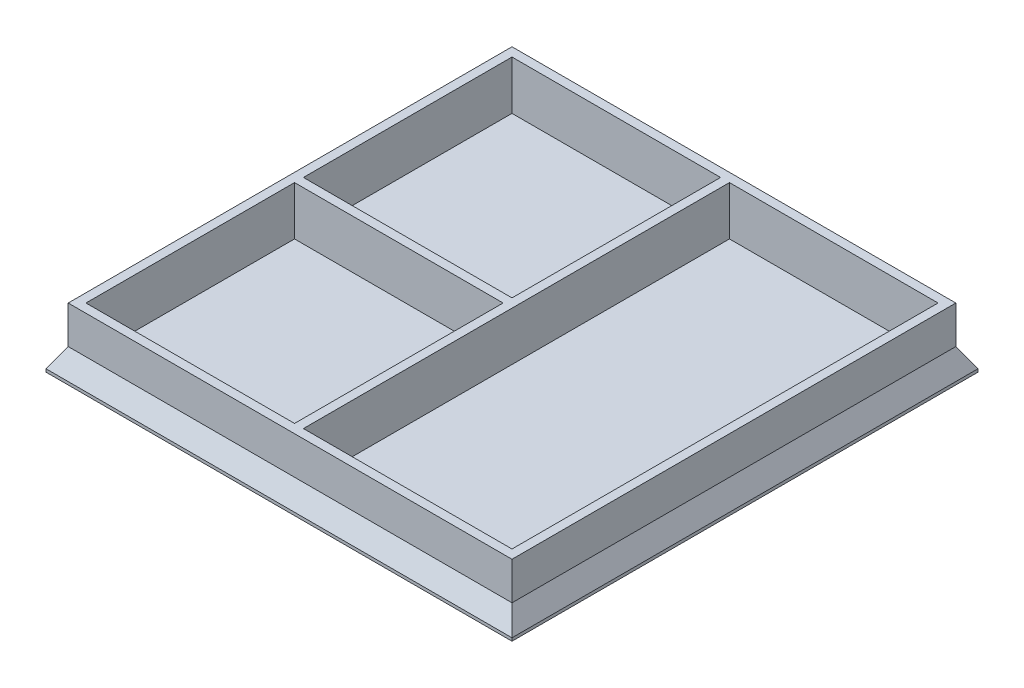
ISO-10303-21;
HEADER;
FILE_DESCRIPTION(('STEP AP214'),'2;1');
FILE_NAME('part.step','',(''),(''),'','','');
FILE_SCHEMA(('AUTOMOTIVE_DESIGN { 1 0 10303 214 1 1 1 1 }'));
ENDSEC;
DATA;
#1=APPLICATION_CONTEXT('core data for automotive mechanical design processes');
#2=APPLICATION_PROTOCOL_DEFINITION('international standard','automotive_design',2000,#1);
#3=PRODUCT_CONTEXT('',#1,'mechanical');
#4=PRODUCT('Part','Part','',(#3));
#5=PRODUCT_RELATED_PRODUCT_CATEGORY('part','',(#4));
#6=PRODUCT_DEFINITION_FORMATION('','',#4);
#7=PRODUCT_DEFINITION_CONTEXT('part definition',#1,'design');
#8=PRODUCT_DEFINITION('design','',#6,#7);
#9=PRODUCT_DEFINITION_SHAPE('','',#8);
#10=(LENGTH_UNIT() NAMED_UNIT(*) SI_UNIT(.MILLI.,.METRE.));
#11=(NAMED_UNIT(*) PLANE_ANGLE_UNIT() SI_UNIT($,.RADIAN.));
#12=(NAMED_UNIT(*) SI_UNIT($,.STERADIAN.) SOLID_ANGLE_UNIT());
#13=UNCERTAINTY_MEASURE_WITH_UNIT(LENGTH_MEASURE(1.E-05),#10,'distance_accuracy_value','');
#14=(GEOMETRIC_REPRESENTATION_CONTEXT(3) GLOBAL_UNCERTAINTY_ASSIGNED_CONTEXT((#13)) GLOBAL_UNIT_ASSIGNED_CONTEXT((#10,
#11,#12)) REPRESENTATION_CONTEXT('',''));
#15=CARTESIAN_POINT('',(0.,0.,0.));
#16=DIRECTION('',(0.,0.,1.));
#17=DIRECTION('',(1.,0.,0.));
#18=AXIS2_PLACEMENT_3D('',#15,#16,#17);
#19=CARTESIAN_POINT('',(0.,10.8,-41.2));
#20=DIRECTION('',(0.,0.,-1.));
#21=DIRECTION('',(-1.,0.,0.));
#22=AXIS2_PLACEMENT_3D('',#19,#20,#21);
#23=PLANE('',#22);
#24=DIRECTION('',(-1.,0.,0.));
#25=VECTOR('',#24,1.);
#26=CARTESIAN_POINT('',(0.,2.,-41.2));
#27=LINE('',#26,#25);
#28=CARTESIAN_POINT('',(-42.8,2.,-41.2));
#29=VERTEX_POINT('',#28);
#30=CARTESIAN_POINT('',(-80.4,2.,-41.2));
#31=VERTEX_POINT('',#30);
#32=EDGE_CURVE('E376',#29,#31,#27,.T.);
#33=ORIENTED_EDGE('',*,*,#32,.F.);
#34=DIRECTION('',(0.,-1.,0.));
#35=VECTOR('',#34,1.);
#36=CARTESIAN_POINT('',(-42.8,10.8,-41.2));
#37=LINE('',#36,#35);
#38=CARTESIAN_POINT('',(-42.8,10.8,-41.2));
#39=VERTEX_POINT('',#38);
#40=EDGE_CURVE('E295',#39,#29,#37,.T.);
#41=ORIENTED_EDGE('',*,*,#40,.F.);
#42=DIRECTION('',(1.,0.,0.));
#43=VECTOR('',#42,1.);
#44=CARTESIAN_POINT('',(0.,10.8,-41.2));
#45=LINE('',#44,#43);
#46=CARTESIAN_POINT('',(-80.4,10.8,-41.2));
#47=VERTEX_POINT('',#46);
#48=EDGE_CURVE('E267',#47,#39,#45,.T.);
#49=ORIENTED_EDGE('',*,*,#48,.F.);
#50=DIRECTION('',(0.,-1.,0.));
#51=VECTOR('',#50,1.);
#52=CARTESIAN_POINT('',(-80.4,10.8,-41.2));
#53=LINE('',#52,#51);
#54=EDGE_CURVE('E282',#47,#31,#53,.T.);
#55=ORIENTED_EDGE('',*,*,#54,.T.);
#56=EDGE_LOOP('',(#33,#41,#49,#55));
#57=FACE_BOUND('',#56,.T.);
#58=ADVANCED_FACE('F41',(#57),#23,.F.);
#59=CARTESIAN_POINT('',(-42.8,10.8,0.));
#60=DIRECTION('',(1.,0.,0.));
#61=DIRECTION('',(0.,0.,-1.));
#62=AXIS2_PLACEMENT_3D('',#59,#60,#61);
#63=PLANE('',#62);
#64=DIRECTION('',(0.,0.,-1.));
#65=VECTOR('',#64,1.);
#66=CARTESIAN_POINT('',(-42.8,2.,0.));
#67=LINE('',#66,#65);
#68=CARTESIAN_POINT('',(-42.8,2.,-3.6));
#69=VERTEX_POINT('',#68);
#70=EDGE_CURVE('E373',#69,#29,#67,.T.);
#71=ORIENTED_EDGE('',*,*,#70,.F.);
#72=DIRECTION('',(0.,-1.,0.));
#73=VECTOR('',#72,1.);
#74=CARTESIAN_POINT('',(-42.8,10.8,-3.6));
#75=LINE('',#74,#73);
#76=CARTESIAN_POINT('',(-42.8,10.8,-3.6));
#77=VERTEX_POINT('',#76);
#78=EDGE_CURVE('E291',#77,#69,#75,.T.);
#79=ORIENTED_EDGE('',*,*,#78,.F.);
#80=DIRECTION('',(0.,0.,1.));
#81=VECTOR('',#80,1.);
#82=CARTESIAN_POINT('',(-42.8,10.8,0.));
#83=LINE('',#82,#81);
#84=EDGE_CURVE('E271',#39,#77,#83,.T.);
#85=ORIENTED_EDGE('',*,*,#84,.F.);
#86=ORIENTED_EDGE('',*,*,#40,.T.);
#87=EDGE_LOOP('',(#71,#79,#85,#86));
#88=FACE_BOUND('',#87,.T.);
#89=ADVANCED_FACE('F458',(#88),#63,.F.);
#90=CARTESIAN_POINT('',(0.,10.8,-3.6));
#91=DIRECTION('',(0.,0.,-1.));
#92=DIRECTION('',(-1.,0.,0.));
#93=AXIS2_PLACEMENT_3D('',#90,#91,#92);
#94=PLANE('',#93);
#95=ORIENTED_EDGE('',*,*,#78,.T.);
#96=DIRECTION('',(-1.,0.,0.));
#97=VECTOR('',#96,1.);
#98=CARTESIAN_POINT('',(0.,2.,-3.6));
#99=LINE('',#98,#97);
#100=CARTESIAN_POINT('',(-80.4,2.,-3.6));
#101=VERTEX_POINT('',#100);
#102=EDGE_CURVE('E369',#69,#101,#99,.T.);
#103=ORIENTED_EDGE('',*,*,#102,.T.);
#104=DIRECTION('',(0.,-1.,0.));
#105=VECTOR('',#104,1.);
#106=CARTESIAN_POINT('',(-80.4,10.8,-3.6));
#107=LINE('',#106,#105);
#108=CARTESIAN_POINT('',(-80.4,10.8,-3.6));
#109=VERTEX_POINT('',#108);
#110=EDGE_CURVE('E286',#109,#101,#107,.T.);
#111=ORIENTED_EDGE('',*,*,#110,.F.);
#112=DIRECTION('',(1.,0.,0.));
#113=VECTOR('',#112,1.);
#114=CARTESIAN_POINT('',(0.,10.8,-3.6));
#115=LINE('',#114,#113);
#116=EDGE_CURVE('E274',#109,#77,#115,.T.);
#117=ORIENTED_EDGE('',*,*,#116,.T.);
#118=EDGE_LOOP('',(#95,#103,#111,#117));
#119=FACE_BOUND('',#118,.T.);
#120=ADVANCED_FACE('F460',(#119),#94,.T.);
#121=CARTESIAN_POINT('',(0.,10.8,-80.4));
#122=DIRECTION('',(0.,0.,-1.));
#123=DIRECTION('',(-1.,0.,0.));
#124=AXIS2_PLACEMENT_3D('',#121,#122,#123);
#125=PLANE('',#124);
#126=DIRECTION('',(-1.,0.,0.));
#127=VECTOR('',#126,1.);
#128=CARTESIAN_POINT('',(0.,2.,-80.4));
#129=LINE('',#128,#127);
#130=CARTESIAN_POINT('',(-42.8,2.,-80.4));
#131=VERTEX_POINT('',#130);
#132=CARTESIAN_POINT('',(-80.4,2.,-80.4));
#133=VERTEX_POINT('',#132);
#134=EDGE_CURVE('E366',#131,#133,#129,.T.);
#135=ORIENTED_EDGE('',*,*,#134,.F.);
#136=DIRECTION('',(0.,-1.,0.));
#137=VECTOR('',#136,1.);
#138=CARTESIAN_POINT('',(-42.8,10.8,-80.4));
#139=LINE('',#138,#137);
#140=CARTESIAN_POINT('',(-42.8,10.8,-80.4));
#141=VERTEX_POINT('',#140);
#142=EDGE_CURVE('E287',#141,#131,#139,.T.);
#143=ORIENTED_EDGE('',*,*,#142,.F.);
#144=DIRECTION('',(1.,0.,0.));
#145=VECTOR('',#144,1.);
#146=CARTESIAN_POINT('',(0.,10.8,-80.4));
#147=LINE('',#146,#145);
#148=CARTESIAN_POINT('',(-80.4,10.8,-80.4));
#149=VERTEX_POINT('',#148);
#150=EDGE_CURVE('E252',#149,#141,#147,.T.);
#151=ORIENTED_EDGE('',*,*,#150,.F.);
#152=DIRECTION('',(0.,-1.,0.));
#153=VECTOR('',#152,1.);
#154=CARTESIAN_POINT('',(-80.4,10.8,-80.4));
#155=LINE('',#154,#153);
#156=EDGE_CURVE('E300',#149,#133,#155,.T.);
#157=ORIENTED_EDGE('',*,*,#156,.T.);
#158=EDGE_LOOP('',(#135,#143,#151,#157));
#159=FACE_BOUND('',#158,.T.);
#160=ADVANCED_FACE('F497',(#159),#125,.F.);
#161=CARTESIAN_POINT('',(-42.8,10.8,0.));
#162=DIRECTION('',(1.,0.,0.));
#163=DIRECTION('',(0.,0.,-1.));
#164=AXIS2_PLACEMENT_3D('',#161,#162,#163);
#165=PLANE('',#164);
#166=DIRECTION('',(0.,0.,-1.));
#167=VECTOR('',#166,1.);
#168=CARTESIAN_POINT('',(-42.8,2.,0.));
#169=LINE('',#168,#167);
#170=CARTESIAN_POINT('',(-42.8,2.,-42.8));
#171=VERTEX_POINT('',#170);
#172=EDGE_CURVE('E363',#171,#131,#169,.T.);
#173=ORIENTED_EDGE('',*,*,#172,.F.);
#174=DIRECTION('',(0.,-1.,0.));
#175=VECTOR('',#174,1.);
#176=CARTESIAN_POINT('',(-42.8,10.8,-42.8));
#177=LINE('',#176,#175);
#178=CARTESIAN_POINT('',(-42.8,10.8,-42.8));
#179=VERTEX_POINT('',#178);
#180=EDGE_CURVE('E309',#179,#171,#177,.T.);
#181=ORIENTED_EDGE('',*,*,#180,.F.);
#182=DIRECTION('',(0.,0.,1.));
#183=VECTOR('',#182,1.);
#184=CARTESIAN_POINT('',(-42.8,10.8,0.));
#185=LINE('',#184,#183);
#186=EDGE_CURVE('E256',#141,#179,#185,.T.);
#187=ORIENTED_EDGE('',*,*,#186,.F.);
#188=ORIENTED_EDGE('',*,*,#142,.T.);
#189=EDGE_LOOP('',(#173,#181,#187,#188));
#190=FACE_BOUND('',#189,.T.);
#191=ADVANCED_FACE('F493',(#190),#165,.F.);
#192=CARTESIAN_POINT('',(0.,10.8,-42.8));
#193=DIRECTION('',(0.,0.,-1.));
#194=DIRECTION('',(-1.,0.,0.));
#195=AXIS2_PLACEMENT_3D('',#192,#193,#194);
#196=PLANE('',#195);
#197=ORIENTED_EDGE('',*,*,#180,.T.);
#198=DIRECTION('',(-1.,0.,0.));
#199=VECTOR('',#198,1.);
#200=CARTESIAN_POINT('',(0.,2.,-42.8));
#201=LINE('',#200,#199);
#202=CARTESIAN_POINT('',(-80.4,2.,-42.8));
#203=VERTEX_POINT('',#202);
#204=EDGE_CURVE('E359',#171,#203,#201,.T.);
#205=ORIENTED_EDGE('',*,*,#204,.T.);
#206=DIRECTION('',(0.,-1.,0.));
#207=VECTOR('',#206,1.);
#208=CARTESIAN_POINT('',(-80.4,10.8,-42.8));
#209=LINE('',#208,#207);
#210=CARTESIAN_POINT('',(-80.4,10.8,-42.8));
#211=VERTEX_POINT('',#210);
#212=EDGE_CURVE('E304',#211,#203,#209,.T.);
#213=ORIENTED_EDGE('',*,*,#212,.F.);
#214=DIRECTION('',(1.,0.,0.));
#215=VECTOR('',#214,1.);
#216=CARTESIAN_POINT('',(0.,10.8,-42.8));
#217=LINE('',#216,#215);
#218=EDGE_CURVE('E259',#211,#179,#217,.T.);
#219=ORIENTED_EDGE('',*,*,#218,.T.);
#220=EDGE_LOOP('',(#197,#205,#213,#219));
#221=FACE_BOUND('',#220,.T.);
#222=ADVANCED_FACE('F489',(#221),#196,.T.);
#223=CARTESIAN_POINT('',(0.,10.8,-80.4));
#224=DIRECTION('',(0.,0.,-1.));
#225=DIRECTION('',(-1.,0.,0.));
#226=AXIS2_PLACEMENT_3D('',#223,#224,#225);
#227=PLANE('',#226);
#228=DIRECTION('',(-1.,0.,0.));
#229=VECTOR('',#228,1.);
#230=CARTESIAN_POINT('',(0.,2.,-80.4));
#231=LINE('',#230,#229);
#232=CARTESIAN_POINT('',(-3.60000000000001,2.,-80.4));
#233=VERTEX_POINT('',#232);
#234=CARTESIAN_POINT('',(-41.2,2.,-80.4));
#235=VERTEX_POINT('',#234);
#236=EDGE_CURVE('E356',#233,#235,#231,.T.);
#237=ORIENTED_EDGE('',*,*,#236,.F.);
#238=DIRECTION('',(0.,-1.,0.));
#239=VECTOR('',#238,1.);
#240=CARTESIAN_POINT('',(-3.60000000000001,10.8,-80.4));
#241=LINE('',#240,#239);
#242=CARTESIAN_POINT('',(-3.60000000000001,10.8,-80.4));
#243=VERTEX_POINT('',#242);
#244=EDGE_CURVE('E305',#243,#233,#241,.T.);
#245=ORIENTED_EDGE('',*,*,#244,.F.);
#246=DIRECTION('',(1.,0.,0.));
#247=VECTOR('',#246,1.);
#248=CARTESIAN_POINT('',(0.,10.8,-80.4));
#249=LINE('',#248,#247);
#250=CARTESIAN_POINT('',(-41.2,10.8,-80.4));
#251=VERTEX_POINT('',#250);
#252=EDGE_CURVE('E237',#251,#243,#249,.T.);
#253=ORIENTED_EDGE('',*,*,#252,.F.);
#254=DIRECTION('',(0.,-1.,0.));
#255=VECTOR('',#254,1.);
#256=CARTESIAN_POINT('',(-41.2,10.8,-80.4));
#257=LINE('',#256,#255);
#258=EDGE_CURVE('E205',#251,#235,#257,.T.);
#259=ORIENTED_EDGE('',*,*,#258,.T.);
#260=EDGE_LOOP('',(#237,#245,#253,#259));
#261=FACE_BOUND('',#260,.T.);
#262=ADVANCED_FACE('F492',(#261),#227,.F.);
#263=CARTESIAN_POINT('',(-3.6,10.8,0.));
#264=DIRECTION('',(1.,0.,0.));
#265=DIRECTION('',(0.,0.,-1.));
#266=AXIS2_PLACEMENT_3D('',#263,#264,#265);
#267=PLANE('',#266);
#268=DIRECTION('',(0.,0.,-1.));
#269=VECTOR('',#268,1.);
#270=CARTESIAN_POINT('',(-3.6,2.,0.));
#271=LINE('',#270,#269);
#272=CARTESIAN_POINT('',(-3.6,2.,-3.6));
#273=VERTEX_POINT('',#272);
#274=EDGE_CURVE('E353',#273,#233,#271,.T.);
#275=ORIENTED_EDGE('',*,*,#274,.F.);
#276=DIRECTION('',(0.,-1.,0.));
#277=VECTOR('',#276,1.);
#278=CARTESIAN_POINT('',(-3.6,10.8,-3.6));
#279=LINE('',#278,#277);
#280=CARTESIAN_POINT('',(-3.6,10.8,-3.6));
#281=VERTEX_POINT('',#280);
#282=EDGE_CURVE('E323',#281,#273,#279,.T.);
#283=ORIENTED_EDGE('',*,*,#282,.F.);
#284=DIRECTION('',(0.,0.,1.));
#285=VECTOR('',#284,1.);
#286=CARTESIAN_POINT('',(-3.6,10.8,0.));
#287=LINE('',#286,#285);
#288=EDGE_CURVE('E241',#243,#281,#287,.T.);
#289=ORIENTED_EDGE('',*,*,#288,.F.);
#290=ORIENTED_EDGE('',*,*,#244,.T.);
#291=EDGE_LOOP('',(#275,#283,#289,#290));
#292=FACE_BOUND('',#291,.T.);
#293=ADVANCED_FACE('F508',(#292),#267,.F.);
#294=CARTESIAN_POINT('',(0.,10.8,-3.6));
#295=DIRECTION('',(0.,0.,-1.));
#296=DIRECTION('',(-1.,0.,0.));
#297=AXIS2_PLACEMENT_3D('',#294,#295,#296);
#298=PLANE('',#297);
#299=ORIENTED_EDGE('',*,*,#282,.T.);
#300=DIRECTION('',(-1.,0.,0.));
#301=VECTOR('',#300,1.);
#302=CARTESIAN_POINT('',(0.,2.,-3.6));
#303=LINE('',#302,#301);
#304=CARTESIAN_POINT('',(-41.2,2.,-3.6));
#305=VERTEX_POINT('',#304);
#306=EDGE_CURVE('E349',#273,#305,#303,.T.);
#307=ORIENTED_EDGE('',*,*,#306,.T.);
#308=DIRECTION('',(0.,-1.,0.));
#309=VECTOR('',#308,1.);
#310=CARTESIAN_POINT('',(-41.2,10.8,-3.6));
#311=LINE('',#310,#309);
#312=CARTESIAN_POINT('',(-41.2,10.8,-3.6));
#313=VERTEX_POINT('',#312);
#314=EDGE_CURVE('E319',#313,#305,#311,.T.);
#315=ORIENTED_EDGE('',*,*,#314,.F.);
#316=DIRECTION('',(1.,0.,0.));
#317=VECTOR('',#316,1.);
#318=CARTESIAN_POINT('',(0.,10.8,-3.6));
#319=LINE('',#318,#317);
#320=EDGE_CURVE('E244',#313,#281,#319,.T.);
#321=ORIENTED_EDGE('',*,*,#320,.T.);
#322=EDGE_LOOP('',(#299,#307,#315,#321));
#323=FACE_BOUND('',#322,.T.);
#324=ADVANCED_FACE('F505',(#323),#298,.T.);
#325=CARTESIAN_POINT('',(-1.99999999999999,10.8,0.));
#326=DIRECTION('',(1.,0.,0.));
#327=DIRECTION('',(0.,0.,-1.));
#328=AXIS2_PLACEMENT_3D('',#325,#326,#327);
#329=PLANE('',#328);
#330=DIRECTION('',(0.,0.,1.));
#331=VECTOR('',#330,1.);
#332=CARTESIAN_POINT('',(-1.99999999999999,4.,0.));
#333=LINE('',#332,#331);
#334=CARTESIAN_POINT('',(-1.99999999999999,4.,-82.));
#335=VERTEX_POINT('',#334);
#336=CARTESIAN_POINT('',(-1.99999999999999,4.,-2.));
#337=VERTEX_POINT('',#336);
#338=EDGE_CURVE('E181',#335,#337,#333,.T.);
#339=ORIENTED_EDGE('',*,*,#338,.F.);
#340=DIRECTION('',(0.,-1.,0.));
#341=VECTOR('',#340,1.);
#342=CARTESIAN_POINT('',(-1.99999999999999,10.8,-82.));
#343=LINE('',#342,#341);
#344=CARTESIAN_POINT('',(-1.99999999999999,10.8,-82.));
#345=VERTEX_POINT('',#344);
#346=EDGE_CURVE('E185',#345,#335,#343,.T.);
#347=ORIENTED_EDGE('',*,*,#346,.F.);
#348=DIRECTION('',(0.,0.,1.));
#349=VECTOR('',#348,1.);
#350=CARTESIAN_POINT('',(-1.99999999999999,10.8,0.));
#351=LINE('',#350,#349);
#352=CARTESIAN_POINT('',(-1.99999999999999,10.8,-2.));
#353=VERTEX_POINT('',#352);
#354=EDGE_CURVE('E226',#345,#353,#351,.T.);
#355=ORIENTED_EDGE('',*,*,#354,.T.);
#356=DIRECTION('',(0.,-1.,0.));
#357=VECTOR('',#356,1.);
#358=CARTESIAN_POINT('',(-1.99999999999999,10.8,-2.));
#359=LINE('',#358,#357);
#360=EDGE_CURVE('E188',#353,#337,#359,.T.);
#361=ORIENTED_EDGE('',*,*,#360,.T.);
#362=EDGE_LOOP('',(#339,#347,#355,#361));
#363=FACE_BOUND('',#362,.T.);
#364=ADVANCED_FACE('F183',(#363),#329,.T.);
#365=CARTESIAN_POINT('',(0.,10.8,-82.));
#366=DIRECTION('',(0.,0.,-1.));
#367=DIRECTION('',(-1.,0.,0.));
#368=AXIS2_PLACEMENT_3D('',#365,#366,#367);
#369=PLANE('',#368);
#370=DIRECTION('',(1.,0.,0.));
#371=VECTOR('',#370,1.);
#372=CARTESIAN_POINT('',(0.,4.,-82.));
#373=LINE('',#372,#371);
#374=CARTESIAN_POINT('',(-82.,4.,-82.));
#375=VERTEX_POINT('',#374);
#376=EDGE_CURVE('E195',#375,#335,#373,.T.);
#377=ORIENTED_EDGE('',*,*,#376,.F.);
#378=DIRECTION('',(0.,-1.,0.));
#379=VECTOR('',#378,1.);
#380=CARTESIAN_POINT('',(-82.,10.8,-82.));
#381=LINE('',#380,#379);
#382=CARTESIAN_POINT('',(-82.,10.8,-82.));
#383=VERTEX_POINT('',#382);
#384=EDGE_CURVE('E206',#383,#375,#381,.T.);
#385=ORIENTED_EDGE('',*,*,#384,.F.);
#386=DIRECTION('',(1.,0.,0.));
#387=VECTOR('',#386,1.);
#388=CARTESIAN_POINT('',(0.,10.8,-82.));
#389=LINE('',#388,#387);
#390=EDGE_CURVE('E203',#383,#345,#389,.T.);
#391=ORIENTED_EDGE('',*,*,#390,.T.);
#392=ORIENTED_EDGE('',*,*,#346,.T.);
#393=EDGE_LOOP('',(#377,#385,#391,#392));
#394=FACE_BOUND('',#393,.T.);
#395=ADVANCED_FACE('F199',(#394),#369,.T.);
#396=CARTESIAN_POINT('',(-82.,10.8,0.));
#397=DIRECTION('',(1.,0.,0.));
#398=DIRECTION('',(0.,0.,-1.));
#399=AXIS2_PLACEMENT_3D('',#396,#397,#398);
#400=PLANE('',#399);
#401=ORIENTED_EDGE('',*,*,#384,.T.);
#402=DIRECTION('',(0.,0.,1.));
#403=VECTOR('',#402,1.);
#404=CARTESIAN_POINT('',(-82.,4.,0.));
#405=LINE('',#404,#403);
#406=CARTESIAN_POINT('',(-82.,4.,-2.));
#407=VERTEX_POINT('',#406);
#408=EDGE_CURVE('E222',#375,#407,#405,.T.);
#409=ORIENTED_EDGE('',*,*,#408,.T.);
#410=DIRECTION('',(0.,-1.,0.));
#411=VECTOR('',#410,1.);
#412=CARTESIAN_POINT('',(-82.,10.8,-2.));
#413=LINE('',#412,#411);
#414=CARTESIAN_POINT('',(-82.,10.8,-2.));
#415=VERTEX_POINT('',#414);
#416=EDGE_CURVE('E332',#415,#407,#413,.T.);
#417=ORIENTED_EDGE('',*,*,#416,.F.);
#418=DIRECTION('',(0.,0.,1.));
#419=VECTOR('',#418,1.);
#420=CARTESIAN_POINT('',(-82.,10.8,0.));
#421=LINE('',#420,#419);
#422=EDGE_CURVE('E231',#383,#415,#421,.T.);
#423=ORIENTED_EDGE('',*,*,#422,.F.);
#424=EDGE_LOOP('',(#401,#409,#417,#423));
#425=FACE_BOUND('',#424,.T.);
#426=ADVANCED_FACE('F430',(#425),#400,.F.);
#427=CARTESIAN_POINT('',(-80.4,10.8,0.));
#428=DIRECTION('',(1.,0.,0.));
#429=DIRECTION('',(0.,0.,-1.));
#430=AXIS2_PLACEMENT_3D('',#427,#428,#429);
#431=PLANE('',#430);
#432=ORIENTED_EDGE('',*,*,#212,.T.);
#433=DIRECTION('',(0.,0.,-1.));
#434=VECTOR('',#433,1.);
#435=CARTESIAN_POINT('',(-80.4,2.,0.));
#436=LINE('',#435,#434);
#437=EDGE_CURVE('E345',#203,#133,#436,.T.);
#438=ORIENTED_EDGE('',*,*,#437,.T.);
#439=ORIENTED_EDGE('',*,*,#156,.F.);
#440=DIRECTION('',(0.,0.,1.));
#441=VECTOR('',#440,1.);
#442=CARTESIAN_POINT('',(-80.4,10.8,0.));
#443=LINE('',#442,#441);
#444=EDGE_CURVE('E263',#149,#211,#443,.T.);
#445=ORIENTED_EDGE('',*,*,#444,.T.);
#446=EDGE_LOOP('',(#432,#438,#439,#445));
#447=FACE_BOUND('',#446,.T.);
#448=ADVANCED_FACE('F484',(#447),#431,.T.);
#449=CARTESIAN_POINT('',(-41.2,10.8,0.));
#450=DIRECTION('',(1.,0.,0.));
#451=DIRECTION('',(0.,0.,-1.));
#452=AXIS2_PLACEMENT_3D('',#449,#450,#451);
#453=PLANE('',#452);
#454=ORIENTED_EDGE('',*,*,#314,.T.);
#455=DIRECTION('',(0.,0.,-1.));
#456=VECTOR('',#455,1.);
#457=CARTESIAN_POINT('',(-41.2,2.,0.));
#458=LINE('',#457,#456);
#459=EDGE_CURVE('E341',#305,#235,#458,.T.);
#460=ORIENTED_EDGE('',*,*,#459,.T.);
#461=ORIENTED_EDGE('',*,*,#258,.F.);
#462=DIRECTION('',(0.,0.,1.));
#463=VECTOR('',#462,1.);
#464=CARTESIAN_POINT('',(-41.2,10.8,0.));
#465=LINE('',#464,#463);
#466=EDGE_CURVE('E248',#251,#313,#465,.T.);
#467=ORIENTED_EDGE('',*,*,#466,.T.);
#468=EDGE_LOOP('',(#454,#460,#461,#467));
#469=FACE_BOUND('',#468,.T.);
#470=ADVANCED_FACE('F487',(#469),#453,.T.);
#471=CARTESIAN_POINT('',(0.,10.8,-2.));
#472=DIRECTION('',(0.,0.,-1.));
#473=DIRECTION('',(-1.,0.,0.));
#474=AXIS2_PLACEMENT_3D('',#471,#472,#473);
#475=PLANE('',#474);
#476=ORIENTED_EDGE('',*,*,#416,.T.);
#477=DIRECTION('',(1.,0.,0.));
#478=VECTOR('',#477,1.);
#479=CARTESIAN_POINT('',(0.,4.,-2.));
#480=LINE('',#479,#478);
#481=EDGE_CURVE('E194',#407,#337,#480,.T.);
#482=ORIENTED_EDGE('',*,*,#481,.T.);
#483=ORIENTED_EDGE('',*,*,#360,.F.);
#484=DIRECTION('',(1.,0.,0.));
#485=VECTOR('',#484,1.);
#486=CARTESIAN_POINT('',(0.,10.8,-2.));
#487=LINE('',#486,#485);
#488=EDGE_CURVE('E234',#415,#353,#487,.T.);
#489=ORIENTED_EDGE('',*,*,#488,.F.);
#490=EDGE_LOOP('',(#476,#482,#483,#489));
#491=FACE_BOUND('',#490,.T.);
#492=ADVANCED_FACE('F433',(#491),#475,.F.);
#493=CARTESIAN_POINT('',(-80.4,10.8,0.));
#494=DIRECTION('',(1.,0.,0.));
#495=DIRECTION('',(0.,0.,-1.));
#496=AXIS2_PLACEMENT_3D('',#493,#494,#495);
#497=PLANE('',#496);
#498=ORIENTED_EDGE('',*,*,#110,.T.);
#499=DIRECTION('',(0.,0.,-1.));
#500=VECTOR('',#499,1.);
#501=CARTESIAN_POINT('',(-80.4,2.,0.));
#502=LINE('',#501,#500);
#503=EDGE_CURVE('E299',#101,#31,#502,.T.);
#504=ORIENTED_EDGE('',*,*,#503,.T.);
#505=ORIENTED_EDGE('',*,*,#54,.F.);
#506=DIRECTION('',(0.,0.,1.));
#507=VECTOR('',#506,1.);
#508=CARTESIAN_POINT('',(-80.4,10.8,0.));
#509=LINE('',#508,#507);
#510=EDGE_CURVE('E278',#47,#109,#509,.T.);
#511=ORIENTED_EDGE('',*,*,#510,.T.);
#512=EDGE_LOOP('',(#498,#504,#505,#511));
#513=FACE_BOUND('',#512,.T.);
#514=ADVANCED_FACE('F439',(#513),#497,.T.);
#515=CARTESIAN_POINT('',(0.,10.8,0.));
#516=DIRECTION('',(0.,1.,0.));
#517=DIRECTION('',(0.,0.,1.));
#518=AXIS2_PLACEMENT_3D('',#515,#516,#517);
#519=PLANE('',#518);
#520=ORIENTED_EDGE('',*,*,#354,.F.);
#521=ORIENTED_EDGE('',*,*,#390,.F.);
#522=ORIENTED_EDGE('',*,*,#422,.T.);
#523=ORIENTED_EDGE('',*,*,#488,.T.);
#524=EDGE_LOOP('',(#520,#521,#522,#523));
#525=FACE_BOUND('',#524,.T.);
#526=ORIENTED_EDGE('',*,*,#252,.T.);
#527=ORIENTED_EDGE('',*,*,#288,.T.);
#528=ORIENTED_EDGE('',*,*,#320,.F.);
#529=ORIENTED_EDGE('',*,*,#466,.F.);
#530=EDGE_LOOP('',(#526,#527,#528,#529));
#531=FACE_BOUND('',#530,.T.);
#532=ORIENTED_EDGE('',*,*,#150,.T.);
#533=ORIENTED_EDGE('',*,*,#186,.T.);
#534=ORIENTED_EDGE('',*,*,#218,.F.);
#535=ORIENTED_EDGE('',*,*,#444,.F.);
#536=EDGE_LOOP('',(#532,#533,#534,#535));
#537=FACE_BOUND('',#536,.T.);
#538=ORIENTED_EDGE('',*,*,#48,.T.);
#539=ORIENTED_EDGE('',*,*,#84,.T.);
#540=ORIENTED_EDGE('',*,*,#116,.F.);
#541=ORIENTED_EDGE('',*,*,#510,.F.);
#542=EDGE_LOOP('',(#538,#539,#540,#541));
#543=FACE_BOUND('',#542,.T.);
#544=ADVANCED_FACE('F435',(#525,#531,#537,#543),#519,.T.);
#545=CARTESIAN_POINT('',(0.,2.,0.));
#546=DIRECTION('',(0.,1.,0.));
#547=DIRECTION('',(0.,0.,1.));
#548=AXIS2_PLACEMENT_3D('',#545,#546,#547);
#549=PLANE('',#548);
#550=ORIENTED_EDGE('',*,*,#70,.T.);
#551=ORIENTED_EDGE('',*,*,#32,.T.);
#552=ORIENTED_EDGE('',*,*,#503,.F.);
#553=ORIENTED_EDGE('',*,*,#102,.F.);
#554=EDGE_LOOP('',(#550,#551,#552,#553));
#555=FACE_BOUND('',#554,.T.);
#556=ADVANCED_FACE('F438',(#555),#549,.T.);
#557=ORIENTED_EDGE('',*,*,#274,.T.);
#558=ORIENTED_EDGE('',*,*,#236,.T.);
#559=ORIENTED_EDGE('',*,*,#459,.F.);
#560=ORIENTED_EDGE('',*,*,#306,.F.);
#561=EDGE_LOOP('',(#557,#558,#559,#560));
#562=FACE_BOUND('',#561,.T.);
#563=ADVANCED_FACE('F464',(#562),#549,.T.);
#564=ORIENTED_EDGE('',*,*,#172,.T.);
#565=ORIENTED_EDGE('',*,*,#134,.T.);
#566=ORIENTED_EDGE('',*,*,#437,.F.);
#567=ORIENTED_EDGE('',*,*,#204,.F.);
#568=EDGE_LOOP('',(#564,#565,#566,#567));
#569=FACE_BOUND('',#568,.T.);
#570=ADVANCED_FACE('F466',(#569),#549,.T.);
#571=CARTESIAN_POINT('',(0.,0.,0.));
#572=DIRECTION('',(0.,1.,0.));
#573=DIRECTION('',(0.,0.,1.));
#574=AXIS2_PLACEMENT_3D('',#571,#572,#573);
#575=PLANE('',#574);
#576=DIRECTION('',(0.,0.,-1.));
#577=VECTOR('',#576,1.);
#578=CARTESIAN_POINT('',(0.,0.,0.));
#579=LINE('',#578,#577);
#580=CARTESIAN_POINT('',(0.,0.,0.));
#581=VERTEX_POINT('',#580);
#582=CARTESIAN_POINT('',(0.,0.,-84.));
#583=VERTEX_POINT('',#582);
#584=EDGE_CURVE('E379',#581,#583,#579,.T.);
#585=ORIENTED_EDGE('',*,*,#584,.F.);
#586=DIRECTION('',(-1.,0.,0.));
#587=VECTOR('',#586,1.);
#588=CARTESIAN_POINT('',(0.,0.,0.));
#589=LINE('',#588,#587);
#590=CARTESIAN_POINT('',(-84.,0.,0.));
#591=VERTEX_POINT('',#590);
#592=EDGE_CURVE('E391',#581,#591,#589,.T.);
#593=ORIENTED_EDGE('',*,*,#592,.T.);
#594=DIRECTION('',(0.,0.,-1.));
#595=VECTOR('',#594,1.);
#596=CARTESIAN_POINT('',(-84.,0.,0.));
#597=LINE('',#596,#595);
#598=CARTESIAN_POINT('',(-84.,0.,-84.));
#599=VERTEX_POINT('',#598);
#600=EDGE_CURVE('E387',#591,#599,#597,.T.);
#601=ORIENTED_EDGE('',*,*,#600,.T.);
#602=DIRECTION('',(-1.,0.,0.));
#603=VECTOR('',#602,1.);
#604=CARTESIAN_POINT('',(0.,0.,-84.));
#605=LINE('',#604,#603);
#606=EDGE_CURVE('E383',#583,#599,#605,.T.);
#607=ORIENTED_EDGE('',*,*,#606,.F.);
#608=EDGE_LOOP('',(#585,#593,#601,#607));
#609=FACE_BOUND('',#608,.T.);
#610=ADVANCED_FACE('F474',(#609),#575,.F.);
#611=CARTESIAN_POINT('',(0.,2.,-84.));
#612=DIRECTION('',(0.,0.,1.));
#613=DIRECTION('',(1.,0.,0.));
#614=AXIS2_PLACEMENT_3D('',#611,#612,#613);
#615=PLANE('',#614);
#616=DIRECTION('',(0.,-1.,0.));
#617=VECTOR('',#616,1.);
#618=CARTESIAN_POINT('',(-84.,2.,-84.));
#619=LINE('',#618,#617);
#620=CARTESIAN_POINT('',(-84.,0.535898384862243,-84.));
#621=VERTEX_POINT('',#620);
#622=EDGE_CURVE('E401',#621,#599,#619,.T.);
#623=ORIENTED_EDGE('',*,*,#622,.F.);
#624=DIRECTION('',(1.,0.,0.));
#625=VECTOR('',#624,1.);
#626=CARTESIAN_POINT('',(0.,0.535898384862243,-84.));
#627=LINE('',#626,#625);
#628=CARTESIAN_POINT('',(0.,0.535898384862243,-84.));
#629=VERTEX_POINT('',#628);
#630=EDGE_CURVE('E67',#621,#629,#627,.T.);
#631=ORIENTED_EDGE('',*,*,#630,.T.);
#632=DIRECTION('',(0.,-1.,0.));
#633=VECTOR('',#632,1.);
#634=CARTESIAN_POINT('',(0.,2.,-84.));
#635=LINE('',#634,#633);
#636=EDGE_CURVE('E404',#629,#583,#635,.T.);
#637=ORIENTED_EDGE('',*,*,#636,.T.);
#638=ORIENTED_EDGE('',*,*,#606,.T.);
#639=EDGE_LOOP('',(#623,#631,#637,#638));
#640=FACE_BOUND('',#639,.T.);
#641=ADVANCED_FACE('F583',(#640),#615,.F.);
#642=CARTESIAN_POINT('',(0.,2.,0.));
#643=DIRECTION('',(-1.,0.,0.));
#644=DIRECTION('',(0.,0.,1.));
#645=AXIS2_PLACEMENT_3D('',#642,#643,#644);
#646=PLANE('',#645);
#647=ORIENTED_EDGE('',*,*,#636,.F.);
#648=DIRECTION('',(0.,0.,1.));
#649=VECTOR('',#648,1.);
#650=CARTESIAN_POINT('',(0.,0.535898384862243,0.));
#651=LINE('',#650,#649);
#652=CARTESIAN_POINT('',(0.,0.535898384862243,0.));
#653=VERTEX_POINT('',#652);
#654=EDGE_CURVE('E52',#629,#653,#651,.T.);
#655=ORIENTED_EDGE('',*,*,#654,.T.);
#656=DIRECTION('',(0.,-1.,0.));
#657=VECTOR('',#656,1.);
#658=CARTESIAN_POINT('',(0.,2.,0.));
#659=LINE('',#658,#657);
#660=EDGE_CURVE('E395',#653,#581,#659,.T.);
#661=ORIENTED_EDGE('',*,*,#660,.T.);
#662=ORIENTED_EDGE('',*,*,#584,.T.);
#663=EDGE_LOOP('',(#647,#655,#661,#662));
#664=FACE_BOUND('',#663,.T.);
#665=ADVANCED_FACE('F592',(#664),#646,.F.);
#666=CARTESIAN_POINT('',(0.,2.,0.));
#667=DIRECTION('',(0.,0.,1.));
#668=DIRECTION('',(1.,0.,0.));
#669=AXIS2_PLACEMENT_3D('',#666,#667,#668);
#670=PLANE('',#669);
#671=ORIENTED_EDGE('',*,*,#660,.F.);
#672=DIRECTION('',(-1.,0.,0.));
#673=VECTOR('',#672,1.);
#674=CARTESIAN_POINT('',(0.,0.535898384862243,0.));
#675=LINE('',#674,#673);
#676=CARTESIAN_POINT('',(-84.,0.535898384862243,0.));
#677=VERTEX_POINT('',#676);
#678=EDGE_CURVE('E11',#653,#677,#675,.T.);
#679=ORIENTED_EDGE('',*,*,#678,.T.);
#680=DIRECTION('',(0.,-1.,0.));
#681=VECTOR('',#680,1.);
#682=CARTESIAN_POINT('',(-84.,2.,0.));
#683=LINE('',#682,#681);
#684=EDGE_CURVE('E398',#677,#591,#683,.T.);
#685=ORIENTED_EDGE('',*,*,#684,.T.);
#686=ORIENTED_EDGE('',*,*,#592,.F.);
#687=EDGE_LOOP('',(#671,#679,#685,#686));
#688=FACE_BOUND('',#687,.T.);
#689=ADVANCED_FACE('F598',(#688),#670,.T.);
#690=CARTESIAN_POINT('',(-84.,2.,0.));
#691=DIRECTION('',(-1.,0.,0.));
#692=DIRECTION('',(0.,0.,1.));
#693=AXIS2_PLACEMENT_3D('',#690,#691,#692);
#694=PLANE('',#693);
#695=ORIENTED_EDGE('',*,*,#684,.F.);
#696=DIRECTION('',(0.,0.,-1.));
#697=VECTOR('',#696,1.);
#698=CARTESIAN_POINT('',(-84.,0.535898384862243,0.));
#699=LINE('',#698,#697);
#700=EDGE_CURVE('E407',#677,#621,#699,.T.);
#701=ORIENTED_EDGE('',*,*,#700,.T.);
#702=ORIENTED_EDGE('',*,*,#622,.T.);
#703=ORIENTED_EDGE('',*,*,#600,.F.);
#704=EDGE_LOOP('',(#695,#701,#702,#703));
#705=FACE_BOUND('',#704,.T.);
#706=ADVANCED_FACE('F605',(#705),#694,.T.);
#707=CARTESIAN_POINT('',(-2.00000000000001,4.,0.));
#708=DIRECTION('',(0.866025403784438,0.500000000000001,0.));
#709=DIRECTION('',(0.,0.,1.));
#710=AXIS2_PLACEMENT_3D('',#707,#708,#709);
#711=PLANE('',#710);
#712=DIRECTION('',(-0.447213595499959,0.774596669241482,0.44721359549996));
#713=VECTOR('',#712,1.);
#714=CARTESIAN_POINT('',(-18.4000000000001,32.4056332441297,-65.5999999999998));
#715=LINE('',#714,#713);
#716=EDGE_CURVE('E209',#335,#629,#715,.F.);
#717=ORIENTED_EDGE('',*,*,#716,.F.);
#718=ORIENTED_EDGE('',*,*,#338,.T.);
#719=DIRECTION('',(0.447213595499959,-0.774596669241482,0.447213595499959));
#720=VECTOR('',#719,1.);
#721=CARTESIAN_POINT('',(0.,0.535898384862243,0.));
#722=LINE('',#721,#720);
#723=EDGE_CURVE('E46',#653,#337,#722,.F.);
#724=ORIENTED_EDGE('',*,*,#723,.F.);
#725=ORIENTED_EDGE('',*,*,#654,.F.);
#726=EDGE_LOOP('',(#717,#718,#724,#725));
#727=FACE_BOUND('',#726,.T.);
#728=ADVANCED_FACE('F44',(#727),#711,.T.);
#729=CARTESIAN_POINT('',(0.,0.535898384862243,0.));
#730=DIRECTION('',(0.,-0.500000000000001,-0.866025403784438));
#731=DIRECTION('',(-1.,0.,0.));
#732=AXIS2_PLACEMENT_3D('',#729,#730,#731);
#733=PLANE('',#732);
#734=ORIENTED_EDGE('',*,*,#723,.T.);
#735=ORIENTED_EDGE('',*,*,#481,.F.);
#736=DIRECTION('',(-0.44721359549996,-0.774596669241482,0.447213595499959));
#737=VECTOR('',#736,1.);
#738=CARTESIAN_POINT('',(-67.1999999999998,29.6343519520195,-16.8000000000001));
#739=LINE('',#738,#737);
#740=EDGE_CURVE('E212',#677,#407,#739,.F.);
#741=ORIENTED_EDGE('',*,*,#740,.F.);
#742=ORIENTED_EDGE('',*,*,#678,.F.);
#743=EDGE_LOOP('',(#734,#735,#741,#742));
#744=FACE_BOUND('',#743,.T.);
#745=ADVANCED_FACE('F426',(#744),#733,.F.);
#746=CARTESIAN_POINT('',(0.,4.,-82.));
#747=DIRECTION('',(0.,0.500000000000003,-0.866025403784437));
#748=DIRECTION('',(1.,0.,0.));
#749=AXIS2_PLACEMENT_3D('',#746,#747,#748);
#750=PLANE('',#749);
#751=ORIENTED_EDGE('',*,*,#716,.T.);
#752=ORIENTED_EDGE('',*,*,#630,.F.);
#753=DIRECTION('',(-0.44721359549996,-0.774596669241481,-0.44721359549996));
#754=VECTOR('',#753,1.);
#755=CARTESIAN_POINT('',(-65.5999999999999,32.4056332441296,-65.5999999999999));
#756=LINE('',#755,#754);
#757=EDGE_CURVE('E215',#375,#621,#756,.T.);
#758=ORIENTED_EDGE('',*,*,#757,.F.);
#759=ORIENTED_EDGE('',*,*,#376,.T.);
#760=EDGE_LOOP('',(#751,#752,#758,#759));
#761=FACE_BOUND('',#760,.T.);
#762=ADVANCED_FACE('F214',(#761),#750,.T.);
#763=CARTESIAN_POINT('',(-84.,0.535898384862243,0.));
#764=DIRECTION('',(0.866025403784437,-0.500000000000003,0.));
#765=DIRECTION('',(0.,0.,-1.));
#766=AXIS2_PLACEMENT_3D('',#763,#764,#765);
#767=PLANE('',#766);
#768=ORIENTED_EDGE('',*,*,#740,.T.);
#769=ORIENTED_EDGE('',*,*,#408,.F.);
#770=ORIENTED_EDGE('',*,*,#757,.T.);
#771=ORIENTED_EDGE('',*,*,#700,.F.);
#772=EDGE_LOOP('',(#768,#769,#770,#771));
#773=FACE_BOUND('',#772,.T.);
#774=ADVANCED_FACE('F423',(#773),#767,.F.);
#775=CLOSED_SHELL('',(#58,#89,#120,#160,#191,#222,#262,#293,#324,#364,#395,#426,#448,#470,#492,
#514,#544,#556,#563,#570,#610,#641,#665,#689,#706,#728,#745,#762,#774));
#776=MANIFOLD_SOLID_BREP('B2',#775);
#777=ADVANCED_BREP_SHAPE_REPRESENTATION('',(#18,#776),#14);
#778=SHAPE_DEFINITION_REPRESENTATION(#9,#777);
ENDSEC;
END-ISO-10303-21;
